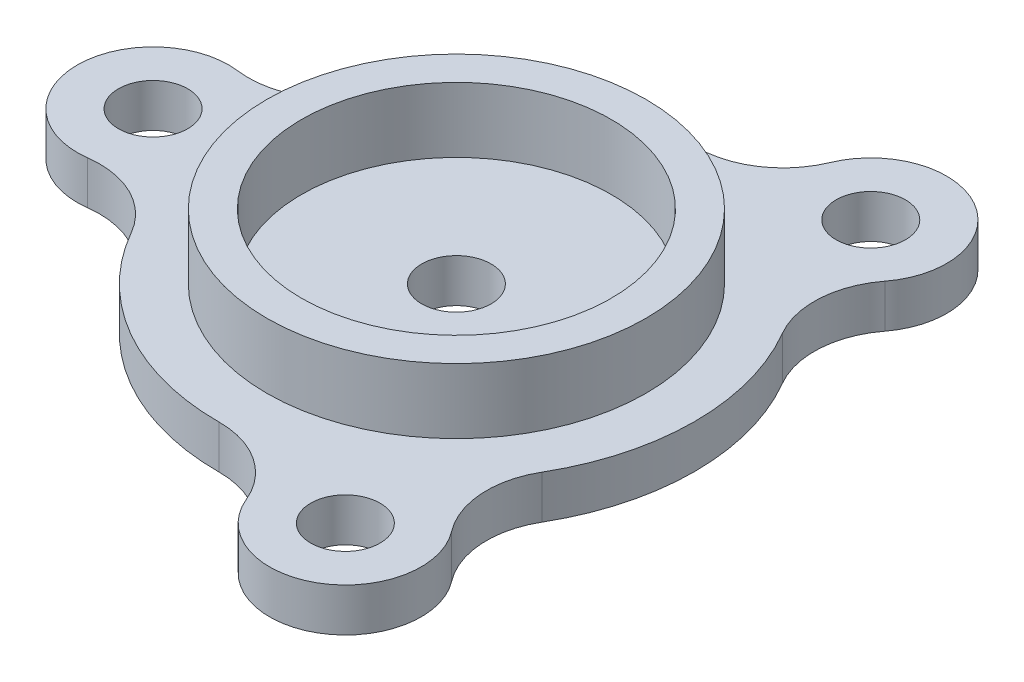
ISO-10303-21;
HEADER;
FILE_DESCRIPTION(('STEP AP214'),'2;1');
FILE_NAME('part.step','',(''),(''),'','','');
FILE_SCHEMA(('AUTOMOTIVE_DESIGN { 1 0 10303 214 1 1 1 1 }'));
ENDSEC;
DATA;
#1=APPLICATION_CONTEXT('core data for automotive mechanical design processes');
#2=APPLICATION_PROTOCOL_DEFINITION('international standard','automotive_design',2000,#1);
#3=PRODUCT_CONTEXT('',#1,'mechanical');
#4=PRODUCT('Part','Part','',(#3));
#5=PRODUCT_RELATED_PRODUCT_CATEGORY('part','',(#4));
#6=PRODUCT_DEFINITION_FORMATION('','',#4);
#7=PRODUCT_DEFINITION_CONTEXT('part definition',#1,'design');
#8=PRODUCT_DEFINITION('design','',#6,#7);
#9=PRODUCT_DEFINITION_SHAPE('','',#8);
#10=(LENGTH_UNIT() NAMED_UNIT(*) SI_UNIT(.MILLI.,.METRE.));
#11=(NAMED_UNIT(*) PLANE_ANGLE_UNIT() SI_UNIT($,.RADIAN.));
#12=(NAMED_UNIT(*) SI_UNIT($,.STERADIAN.) SOLID_ANGLE_UNIT());
#13=UNCERTAINTY_MEASURE_WITH_UNIT(LENGTH_MEASURE(1.E-05),#10,'distance_accuracy_value','');
#14=(GEOMETRIC_REPRESENTATION_CONTEXT(3) GLOBAL_UNCERTAINTY_ASSIGNED_CONTEXT((#13)) GLOBAL_UNIT_ASSIGNED_CONTEXT((#10,
#11,#12)) REPRESENTATION_CONTEXT('',''));
#15=CARTESIAN_POINT('',(0.,0.,0.));
#16=DIRECTION('',(0.,0.,1.));
#17=DIRECTION('',(1.,0.,0.));
#18=AXIS2_PLACEMENT_3D('',#15,#16,#17);
#19=CARTESIAN_POINT('',(0.,2.,0.));
#20=DIRECTION('',(0.,1.,0.));
#21=DIRECTION('',(0.,0.,1.));
#22=AXIS2_PLACEMENT_3D('',#19,#20,#21);
#23=PLANE('',#22);
#24=CARTESIAN_POINT('',(0.,2.,0.));
#25=DIRECTION('',(0.,1.,0.));
#26=DIRECTION('',(0.,0.,1.));
#27=AXIS2_PLACEMENT_3D('',#24,#25,#26);
#28=CIRCLE('',#27,1.6);
#29=CARTESIAN_POINT('',(0.,2.,1.6));
#30=VERTEX_POINT('',#29);
#31=EDGE_CURVE('E302',#30,#30,#28,.T.);
#32=ORIENTED_EDGE('',*,*,#31,.F.);
#33=EDGE_LOOP('',(#32));
#34=FACE_BOUND('',#33,.T.);
#35=CARTESIAN_POINT('',(0.,2.,0.));
#36=DIRECTION('',(0.,1.,0.));
#37=DIRECTION('',(0.,0.,1.));
#38=AXIS2_PLACEMENT_3D('',#35,#36,#37);
#39=CIRCLE('',#38,7.15);
#40=CARTESIAN_POINT('',(0.,2.,7.15));
#41=VERTEX_POINT('',#40);
#42=EDGE_CURVE('E11',#41,#41,#39,.F.);
#43=ORIENTED_EDGE('',*,*,#42,.F.);
#44=EDGE_LOOP('',(#43));
#45=FACE_BOUND('',#44,.T.);
#46=ADVANCED_FACE('F34',(#34,#45),#23,.T.);
#47=CARTESIAN_POINT('',(0.,2.,0.));
#48=DIRECTION('',(0.,-1.,0.));
#49=DIRECTION('',(0.,0.,-1.));
#50=AXIS2_PLACEMENT_3D('',#47,#48,#49);
#51=CYLINDRICAL_SURFACE('',#50,11.);
#52=DIRECTION('',(0.,1.,0.));
#53=VECTOR('',#52,1.);
#54=CARTESIAN_POINT('',(-9.55297619047619,-14.5152553066844,5.4534985013471));
#55=LINE('',#54,#53);
#56=CARTESIAN_POINT('',(-9.55297619047619,0.,5.4534985013471));
#57=VERTEX_POINT('',#56);
#58=CARTESIAN_POINT('',(-9.55297619047619,2.,5.45349850134709));
#59=VERTEX_POINT('',#58);
#60=EDGE_CURVE('E156',#57,#59,#55,.T.);
#61=ORIENTED_EDGE('',*,*,#60,.F.);
#62=CARTESIAN_POINT('',(0.,0.,0.));
#63=DIRECTION('',(0.,1.,0.));
#64=DIRECTION('',(0.,0.,1.));
#65=AXIS2_PLACEMENT_3D('',#62,#63,#64);
#66=CIRCLE('',#65,11.);
#67=CARTESIAN_POINT('',(0.0536198535711454,0.,10.9998693133738));
#68=VERTEX_POINT('',#67);
#69=EDGE_CURVE('E229',#57,#68,#66,.T.);
#70=ORIENTED_EDGE('',*,*,#69,.T.);
#71=DIRECTION('',(0.,1.,0.));
#72=VECTOR('',#71,1.);
#73=CARTESIAN_POINT('',(0.0536198535711407,-14.5152553066844,10.9998693133738));
#74=LINE('',#73,#72);
#75=CARTESIAN_POINT('',(0.0536198535711454,2.,10.9998693133738));
#76=VERTEX_POINT('',#75);
#77=EDGE_CURVE('E189',#68,#76,#74,.T.);
#78=ORIENTED_EDGE('',*,*,#77,.T.);
#79=CARTESIAN_POINT('',(0.,2.,0.));
#80=DIRECTION('',(0.,1.,0.));
#81=DIRECTION('',(0.,0.,1.));
#82=AXIS2_PLACEMENT_3D('',#79,#80,#81);
#83=CIRCLE('',#82,11.);
#84=EDGE_CURVE('E49',#59,#76,#83,.T.);
#85=ORIENTED_EDGE('',*,*,#84,.F.);
#86=EDGE_LOOP('',(#61,#70,#78,#85));
#87=FACE_BOUND('',#86,.T.);
#88=ADVANCED_FACE('F260',(#87),#51,.T.);
#89=DIRECTION('',(0.,1.,0.));
#90=VECTOR('',#89,1.);
#91=CARTESIAN_POINT('',(9.49935633690504,-14.5152553066844,5.54637081202673));
#92=LINE('',#91,#90);
#93=CARTESIAN_POINT('',(9.49935633690504,0.,5.54637081202673));
#94=VERTEX_POINT('',#93);
#95=CARTESIAN_POINT('',(9.49935633690504,2.,5.54637081202673));
#96=VERTEX_POINT('',#95);
#97=EDGE_CURVE('E185',#94,#96,#92,.T.);
#98=ORIENTED_EDGE('',*,*,#97,.F.);
#99=CARTESIAN_POINT('',(9.49935633690505,0.,-5.54637081202672));
#100=VERTEX_POINT('',#99);
#101=EDGE_CURVE('E226',#94,#100,#66,.T.);
#102=ORIENTED_EDGE('',*,*,#101,.T.);
#103=DIRECTION('',(0.,1.,0.));
#104=VECTOR('',#103,1.);
#105=CARTESIAN_POINT('',(9.49935633690505,-14.5152553066844,-5.54637081202672));
#106=LINE('',#105,#104);
#107=CARTESIAN_POINT('',(9.49935633690505,2.,-5.54637081202672));
#108=VERTEX_POINT('',#107);
#109=EDGE_CURVE('E202',#100,#108,#106,.T.);
#110=ORIENTED_EDGE('',*,*,#109,.T.);
#111=EDGE_CURVE('E227',#96,#108,#83,.T.);
#112=ORIENTED_EDGE('',*,*,#111,.F.);
#113=EDGE_LOOP('',(#98,#102,#110,#112));
#114=FACE_BOUND('',#113,.T.);
#115=ADVANCED_FACE('F233',(#114),#51,.T.);
#116=CARTESIAN_POINT('',(0.053619853571149,0.,-10.9998693133738));
#117=VERTEX_POINT('',#116);
#118=CARTESIAN_POINT('',(-9.55297619047619,0.,-5.45349850134709));
#119=VERTEX_POINT('',#118);
#120=EDGE_CURVE('E228',#117,#119,#66,.T.);
#121=ORIENTED_EDGE('',*,*,#120,.T.);
#122=DIRECTION('',(0.,1.,0.));
#123=VECTOR('',#122,1.);
#124=CARTESIAN_POINT('',(-9.55297619047619,-14.5152553066844,-5.45349850134709));
#125=LINE('',#124,#123);
#126=CARTESIAN_POINT('',(-9.55297619047619,2.,-5.45349850134709));
#127=VERTEX_POINT('',#126);
#128=EDGE_CURVE('E57',#119,#127,#125,.T.);
#129=ORIENTED_EDGE('',*,*,#128,.T.);
#130=CARTESIAN_POINT('',(0.053619853571149,2.,-10.9998693133738));
#131=VERTEX_POINT('',#130);
#132=EDGE_CURVE('E42',#131,#127,#83,.T.);
#133=ORIENTED_EDGE('',*,*,#132,.F.);
#134=DIRECTION('',(0.,1.,0.));
#135=VECTOR('',#134,1.);
#136=CARTESIAN_POINT('',(0.053619853571149,-14.5152553066844,-10.9998693133738));
#137=LINE('',#136,#135);
#138=EDGE_CURVE('E218',#117,#131,#137,.T.);
#139=ORIENTED_EDGE('',*,*,#138,.F.);
#140=EDGE_LOOP('',(#121,#129,#133,#139));
#141=FACE_BOUND('',#140,.T.);
#142=ADVANCED_FACE('F36',(#141),#51,.T.);
#143=CARTESIAN_POINT('',(0.,2.,0.));
#144=DIRECTION('',(0.,1.,0.));
#145=DIRECTION('',(0.,0.,1.));
#146=AXIS2_PLACEMENT_3D('',#143,#144,#145);
#147=CIRCLE('',#146,8.75);
#148=CARTESIAN_POINT('',(0.,2.,8.75));
#149=VERTEX_POINT('',#148);
#150=EDGE_CURVE('E296',#149,#149,#147,.T.);
#151=ORIENTED_EDGE('',*,*,#150,.F.);
#152=EDGE_LOOP('',(#151));
#153=FACE_BOUND('',#152,.T.);
#154=ORIENTED_EDGE('',*,*,#132,.T.);
#155=CARTESIAN_POINT('',(-13.0267857142857,2.,-7.43658886547331));
#156=DIRECTION('',(0.,-1.,0.));
#157=DIRECTION('',(0.,0.,1.));
#158=AXIS2_PLACEMENT_3D('',#155,#156,#157);
#159=CIRCLE('',#158,4.);
#160=CARTESIAN_POINT('',(-13.5458333333333,2.,-3.47040813722088));
#161=VERTEX_POINT('',#160);
#162=EDGE_CURVE('E129',#127,#161,#159,.T.);
#163=ORIENTED_EDGE('',*,*,#162,.T.);
#164=CARTESIAN_POINT('',(-14.,2.,0.));
#165=DIRECTION('',(0.,1.,0.));
#166=DIRECTION('',(0.,0.,1.));
#167=AXIS2_PLACEMENT_3D('',#164,#165,#166);
#168=CIRCLE('',#167,3.5);
#169=CARTESIAN_POINT('',(-13.5458333333333,2.,3.47040813722088));
#170=VERTEX_POINT('',#169);
#171=EDGE_CURVE('E137',#161,#170,#168,.T.);
#172=ORIENTED_EDGE('',*,*,#171,.T.);
#173=CARTESIAN_POINT('',(-13.0267857142857,2.,7.43658886547331));
#174=DIRECTION('',(0.,-1.,0.));
#175=DIRECTION('',(0.,0.,1.));
#176=AXIS2_PLACEMENT_3D('',#173,#174,#175);
#177=CIRCLE('',#176,4.);
#178=EDGE_CURVE('E143',#170,#59,#177,.T.);
#179=ORIENTED_EDGE('',*,*,#178,.T.);
#180=ORIENTED_EDGE('',*,*,#84,.T.);
#181=CARTESIAN_POINT('',(0.0731179821424711,2.,14.9998217909643));
#182=DIRECTION('',(0.,-1.,0.));
#183=DIRECTION('',(0.,0.,1.));
#184=AXIS2_PLACEMENT_3D('',#181,#182,#183);
#185=CIRCLE('',#184,4.);
#186=CARTESIAN_POINT('',(3.76745505833315,2.,13.4662398507072));
#187=VERTEX_POINT('',#186);
#188=EDGE_CURVE('E179',#76,#187,#185,.T.);
#189=ORIENTED_EDGE('',*,*,#188,.T.);
#190=CARTESIAN_POINT('',(7.,2.,12.1243556529821));
#191=DIRECTION('',(0.,1.,0.));
#192=DIRECTION('',(0.,0.,1.));
#193=AXIS2_PLACEMENT_3D('',#190,#191,#192);
#194=CIRCLE('',#193,3.5);
#195=CARTESIAN_POINT('',(9.77837827500018,2.,9.99583171348627));
#196=VERTEX_POINT('',#195);
#197=EDGE_CURVE('E182',#187,#196,#194,.T.);
#198=ORIENTED_EDGE('',*,*,#197,.T.);
#199=CARTESIAN_POINT('',(12.9536677321432,2.,7.56323292549099));
#200=DIRECTION('',(0.,-1.,0.));
#201=DIRECTION('',(0.,0.,1.));
#202=AXIS2_PLACEMENT_3D('',#199,#200,#201);
#203=CIRCLE('',#202,4.);
#204=EDGE_CURVE('E176',#196,#96,#203,.T.);
#205=ORIENTED_EDGE('',*,*,#204,.T.);
#206=ORIENTED_EDGE('',*,*,#111,.T.);
#207=CARTESIAN_POINT('',(12.9536677321432,2.,-7.56323292549098));
#208=DIRECTION('',(0.,-1.,0.));
#209=DIRECTION('',(0.,0.,1.));
#210=AXIS2_PLACEMENT_3D('',#207,#208,#209);
#211=CIRCLE('',#210,4.);
#212=CARTESIAN_POINT('',(9.77837827500019,2.,-9.99583171348627));
#213=VERTEX_POINT('',#212);
#214=EDGE_CURVE('E207',#108,#213,#211,.T.);
#215=ORIENTED_EDGE('',*,*,#214,.T.);
#216=CARTESIAN_POINT('',(7.00000000000001,2.,-12.1243556529821));
#217=DIRECTION('',(0.,1.,0.));
#218=DIRECTION('',(0.,0.,1.));
#219=AXIS2_PLACEMENT_3D('',#216,#217,#218);
#220=CIRCLE('',#219,3.5);
#221=CARTESIAN_POINT('',(3.76745505833316,2.,-13.4662398507071));
#222=VERTEX_POINT('',#221);
#223=EDGE_CURVE('E210',#213,#222,#220,.T.);
#224=ORIENTED_EDGE('',*,*,#223,.T.);
#225=CARTESIAN_POINT('',(0.0731179821424827,2.,-14.9998217909643));
#226=DIRECTION('',(0.,-1.,0.));
#227=DIRECTION('',(0.,0.,1.));
#228=AXIS2_PLACEMENT_3D('',#225,#226,#227);
#229=CIRCLE('',#228,3.99999999999999);
#230=EDGE_CURVE('E213',#222,#131,#229,.T.);
#231=ORIENTED_EDGE('',*,*,#230,.T.);
#232=EDGE_LOOP('',(#154,#163,#172,#179,#180,#189,#198,#205,#206,#215,#224,#231));
#233=FACE_BOUND('',#232,.T.);
#234=CARTESIAN_POINT('',(7.00000000000001,2.,-12.1243556529821));
#235=DIRECTION('',(0.,1.,0.));
#236=DIRECTION('',(0.,0.,1.));
#237=AXIS2_PLACEMENT_3D('',#234,#235,#236);
#238=CIRCLE('',#237,1.6);
#239=CARTESIAN_POINT('',(7.00000000000001,2.,-10.5243556529821));
#240=VERTEX_POINT('',#239);
#241=EDGE_CURVE('E195',#240,#240,#238,.T.);
#242=ORIENTED_EDGE('',*,*,#241,.F.);
#243=EDGE_LOOP('',(#242));
#244=FACE_BOUND('',#243,.T.);
#245=CARTESIAN_POINT('',(7.,2.,12.1243556529821));
#246=DIRECTION('',(0.,1.,0.));
#247=DIRECTION('',(0.,0.,1.));
#248=AXIS2_PLACEMENT_3D('',#245,#246,#247);
#249=CIRCLE('',#248,1.6);
#250=CARTESIAN_POINT('',(7.,2.,13.7243556529821));
#251=VERTEX_POINT('',#250);
#252=EDGE_CURVE('E164',#251,#251,#249,.T.);
#253=ORIENTED_EDGE('',*,*,#252,.F.);
#254=EDGE_LOOP('',(#253));
#255=FACE_BOUND('',#254,.T.);
#256=CARTESIAN_POINT('',(-14.,2.,0.));
#257=DIRECTION('',(0.,1.,0.));
#258=DIRECTION('',(0.,0.,1.));
#259=AXIS2_PLACEMENT_3D('',#256,#257,#258);
#260=CIRCLE('',#259,1.6);
#261=CARTESIAN_POINT('',(-14.,2.,1.6));
#262=VERTEX_POINT('',#261);
#263=EDGE_CURVE('E148',#262,#262,#260,.T.);
#264=ORIENTED_EDGE('',*,*,#263,.F.);
#265=EDGE_LOOP('',(#264));
#266=FACE_BOUND('',#265,.T.);
#267=ADVANCED_FACE('F145',(#153,#233,#244,#255,#266),#23,.T.);
#268=CARTESIAN_POINT('',(0.,0.,0.));
#269=DIRECTION('',(0.,1.,0.));
#270=DIRECTION('',(0.,0.,1.));
#271=AXIS2_PLACEMENT_3D('',#268,#269,#270);
#272=PLANE('',#271);
#273=CARTESIAN_POINT('',(0.,0.,0.));
#274=DIRECTION('',(0.,1.,0.));
#275=DIRECTION('',(0.,0.,1.));
#276=AXIS2_PLACEMENT_3D('',#273,#274,#275);
#277=CIRCLE('',#276,1.6);
#278=CARTESIAN_POINT('',(0.,0.,1.6));
#279=VERTEX_POINT('',#278);
#280=EDGE_CURVE('E151',#279,#279,#277,.F.);
#281=ORIENTED_EDGE('',*,*,#280,.F.);
#282=EDGE_LOOP('',(#281));
#283=FACE_BOUND('',#282,.T.);
#284=ORIENTED_EDGE('',*,*,#120,.F.);
#285=CARTESIAN_POINT('',(0.0731179821424827,0.,-14.9998217909643));
#286=DIRECTION('',(0.,1.,0.));
#287=DIRECTION('',(0.,0.,1.));
#288=AXIS2_PLACEMENT_3D('',#285,#286,#287);
#289=CIRCLE('',#288,3.99999999999999);
#290=CARTESIAN_POINT('',(3.76745505833316,0.,-13.4662398507071));
#291=VERTEX_POINT('',#290);
#292=EDGE_CURVE('E200',#117,#291,#289,.T.);
#293=ORIENTED_EDGE('',*,*,#292,.T.);
#294=CARTESIAN_POINT('',(7.00000000000001,0.,-12.1243556529821));
#295=DIRECTION('',(0.,1.,0.));
#296=DIRECTION('',(0.,0.,1.));
#297=AXIS2_PLACEMENT_3D('',#294,#295,#296);
#298=CIRCLE('',#297,3.5);
#299=CARTESIAN_POINT('',(9.77837827500019,0.,-9.99583171348627));
#300=VERTEX_POINT('',#299);
#301=EDGE_CURVE('E196',#291,#300,#298,.F.);
#302=ORIENTED_EDGE('',*,*,#301,.T.);
#303=CARTESIAN_POINT('',(12.9536677321432,0.,-7.56323292549098));
#304=DIRECTION('',(0.,1.,0.));
#305=DIRECTION('',(0.,0.,1.));
#306=AXIS2_PLACEMENT_3D('',#303,#304,#305);
#307=CIRCLE('',#306,4.);
#308=EDGE_CURVE('E199',#300,#100,#307,.T.);
#309=ORIENTED_EDGE('',*,*,#308,.T.);
#310=ORIENTED_EDGE('',*,*,#101,.F.);
#311=CARTESIAN_POINT('',(12.9536677321432,0.,7.56323292549099));
#312=DIRECTION('',(0.,1.,0.));
#313=DIRECTION('',(0.,0.,1.));
#314=AXIS2_PLACEMENT_3D('',#311,#312,#313);
#315=CIRCLE('',#314,4.);
#316=CARTESIAN_POINT('',(9.77837827500018,0.,9.99583171348627));
#317=VERTEX_POINT('',#316);
#318=EDGE_CURVE('E171',#94,#317,#315,.T.);
#319=ORIENTED_EDGE('',*,*,#318,.T.);
#320=CARTESIAN_POINT('',(7.,0.,12.1243556529821));
#321=DIRECTION('',(0.,1.,0.));
#322=DIRECTION('',(0.,0.,1.));
#323=AXIS2_PLACEMENT_3D('',#320,#321,#322);
#324=CIRCLE('',#323,3.5);
#325=CARTESIAN_POINT('',(3.76745505833315,0.,13.4662398507072));
#326=VERTEX_POINT('',#325);
#327=EDGE_CURVE('E168',#317,#326,#324,.F.);
#328=ORIENTED_EDGE('',*,*,#327,.T.);
#329=CARTESIAN_POINT('',(0.0731179821424711,0.,14.9998217909643));
#330=DIRECTION('',(0.,1.,0.));
#331=DIRECTION('',(0.,0.,1.));
#332=AXIS2_PLACEMENT_3D('',#329,#330,#331);
#333=CIRCLE('',#332,4.);
#334=EDGE_CURVE('E165',#326,#68,#333,.T.);
#335=ORIENTED_EDGE('',*,*,#334,.T.);
#336=ORIENTED_EDGE('',*,*,#69,.F.);
#337=CARTESIAN_POINT('',(-13.0267857142857,0.,7.43658886547331));
#338=DIRECTION('',(0.,1.,0.));
#339=DIRECTION('',(0.,0.,1.));
#340=AXIS2_PLACEMENT_3D('',#337,#338,#339);
#341=CIRCLE('',#340,4.);
#342=CARTESIAN_POINT('',(-13.5458333333333,0.,3.47040813722088));
#343=VERTEX_POINT('',#342);
#344=EDGE_CURVE('E262',#57,#343,#341,.T.);
#345=ORIENTED_EDGE('',*,*,#344,.T.);
#346=CARTESIAN_POINT('',(-14.,0.,0.));
#347=DIRECTION('',(0.,1.,0.));
#348=DIRECTION('',(0.,0.,1.));
#349=AXIS2_PLACEMENT_3D('',#346,#347,#348);
#350=CIRCLE('',#349,3.5);
#351=CARTESIAN_POINT('',(-13.5458333333333,0.,-3.47040813722088));
#352=VERTEX_POINT('',#351);
#353=EDGE_CURVE('E158',#343,#352,#350,.F.);
#354=ORIENTED_EDGE('',*,*,#353,.T.);
#355=CARTESIAN_POINT('',(-13.0267857142857,0.,-7.43658886547331));
#356=DIRECTION('',(0.,1.,0.));
#357=DIRECTION('',(0.,0.,1.));
#358=AXIS2_PLACEMENT_3D('',#355,#356,#357);
#359=CIRCLE('',#358,4.);
#360=EDGE_CURVE('E131',#352,#119,#359,.T.);
#361=ORIENTED_EDGE('',*,*,#360,.T.);
#362=EDGE_LOOP('',(#284,#293,#302,#309,#310,#319,#328,#335,#336,#345,#354,#361));
#363=FACE_BOUND('',#362,.T.);
#364=CARTESIAN_POINT('',(7.00000000000001,0.,-12.1243556529821));
#365=DIRECTION('',(0.,1.,0.));
#366=DIRECTION('',(0.,0.,1.));
#367=AXIS2_PLACEMENT_3D('',#364,#365,#366);
#368=CIRCLE('',#367,1.6);
#369=CARTESIAN_POINT('',(7.00000000000001,0.,-10.5243556529821));
#370=VERTEX_POINT('',#369);
#371=EDGE_CURVE('E198',#370,#370,#368,.F.);
#372=ORIENTED_EDGE('',*,*,#371,.F.);
#373=EDGE_LOOP('',(#372));
#374=FACE_BOUND('',#373,.T.);
#375=CARTESIAN_POINT('',(7.,0.,12.1243556529821));
#376=DIRECTION('',(0.,1.,0.));
#377=DIRECTION('',(0.,0.,1.));
#378=AXIS2_PLACEMENT_3D('',#375,#376,#377);
#379=CIRCLE('',#378,1.6);
#380=CARTESIAN_POINT('',(7.,0.,13.7243556529821));
#381=VERTEX_POINT('',#380);
#382=EDGE_CURVE('E173',#381,#381,#379,.F.);
#383=ORIENTED_EDGE('',*,*,#382,.F.);
#384=EDGE_LOOP('',(#383));
#385=FACE_BOUND('',#384,.T.);
#386=CARTESIAN_POINT('',(-14.,0.,0.));
#387=DIRECTION('',(0.,1.,0.));
#388=DIRECTION('',(0.,0.,1.));
#389=AXIS2_PLACEMENT_3D('',#386,#387,#388);
#390=CIRCLE('',#389,1.6);
#391=CARTESIAN_POINT('',(-14.,0.,1.6));
#392=VERTEX_POINT('',#391);
#393=EDGE_CURVE('E161',#392,#392,#390,.F.);
#394=ORIENTED_EDGE('',*,*,#393,.F.);
#395=EDGE_LOOP('',(#394));
#396=FACE_BOUND('',#395,.T.);
#397=ADVANCED_FACE('F239',(#283,#363,#374,#385,#396),#272,.F.);
#398=CARTESIAN_POINT('',(7.00000000000001,-14.5152553066844,-12.1243556529821));
#399=DIRECTION('',(0.,1.,0.));
#400=DIRECTION('',(0.,0.,1.));
#401=AXIS2_PLACEMENT_3D('',#398,#399,#400);
#402=CYLINDRICAL_SURFACE('',#401,3.5);
#403=ORIENTED_EDGE('',*,*,#301,.F.);
#404=DIRECTION('',(0.,1.,0.));
#405=VECTOR('',#404,1.);
#406=CARTESIAN_POINT('',(3.76745505833316,-14.5152553066844,-13.4662398507071));
#407=LINE('',#406,#405);
#408=EDGE_CURVE('E221',#291,#222,#407,.T.);
#409=ORIENTED_EDGE('',*,*,#408,.T.);
#410=ORIENTED_EDGE('',*,*,#223,.F.);
#411=DIRECTION('',(0.,1.,0.));
#412=VECTOR('',#411,1.);
#413=CARTESIAN_POINT('',(9.77837827500019,-14.5152553066844,-9.99583171348627));
#414=LINE('',#413,#412);
#415=EDGE_CURVE('E215',#300,#213,#414,.T.);
#416=ORIENTED_EDGE('',*,*,#415,.F.);
#417=EDGE_LOOP('',(#403,#409,#410,#416));
#418=FACE_BOUND('',#417,.T.);
#419=ADVANCED_FACE('F292',(#418),#402,.T.);
#420=CARTESIAN_POINT('',(0.0731179821424827,-14.5152553066844,-14.9998217909643));
#421=DIRECTION('',(0.,1.,0.));
#422=DIRECTION('',(0.,0.,1.));
#423=AXIS2_PLACEMENT_3D('',#420,#421,#422);
#424=CYLINDRICAL_SURFACE('',#423,3.99999999999999);
#425=ORIENTED_EDGE('',*,*,#292,.F.);
#426=ORIENTED_EDGE('',*,*,#138,.T.);
#427=ORIENTED_EDGE('',*,*,#230,.F.);
#428=ORIENTED_EDGE('',*,*,#408,.F.);
#429=EDGE_LOOP('',(#425,#426,#427,#428));
#430=FACE_BOUND('',#429,.T.);
#431=ADVANCED_FACE('F315',(#430),#424,.F.);
#432=CARTESIAN_POINT('',(12.9536677321432,-14.5152553066844,-7.56323292549098));
#433=DIRECTION('',(0.,1.,0.));
#434=DIRECTION('',(0.,0.,1.));
#435=AXIS2_PLACEMENT_3D('',#432,#433,#434);
#436=CYLINDRICAL_SURFACE('',#435,4.);
#437=ORIENTED_EDGE('',*,*,#308,.F.);
#438=ORIENTED_EDGE('',*,*,#415,.T.);
#439=ORIENTED_EDGE('',*,*,#214,.F.);
#440=ORIENTED_EDGE('',*,*,#109,.F.);
#441=EDGE_LOOP('',(#437,#438,#439,#440));
#442=FACE_BOUND('',#441,.T.);
#443=ADVANCED_FACE('F244',(#442),#436,.F.);
#444=CARTESIAN_POINT('',(7.00000000000001,-14.5152553066844,-12.1243556529821));
#445=DIRECTION('',(0.,1.,0.));
#446=DIRECTION('',(0.,0.,1.));
#447=AXIS2_PLACEMENT_3D('',#444,#445,#446);
#448=CYLINDRICAL_SURFACE('',#447,1.6);
#449=CARTESIAN_POINT('',(7.00000000000001,0.,-10.5243556529821));
#450=CARTESIAN_POINT('',(7.00000000000001,0.0208333333333333,-10.5243556529821));
#451=CARTESIAN_POINT('',(7.00000000000001,0.0416666666666667,-10.5243556529821));
#452=CARTESIAN_POINT('',(7.00000000000001,0.0833333333333334,-10.5243556529821));
#453=CARTESIAN_POINT('',(7.00000000000001,0.104166666666667,-10.5243556529821));
#454=CARTESIAN_POINT('',(7.00000000000001,0.145833333333333,-10.5243556529821));
#455=CARTESIAN_POINT('',(7.00000000000001,0.166666666666667,-10.5243556529821));
#456=CARTESIAN_POINT('',(7.00000000000001,0.208333333333334,-10.5243556529821));
#457=CARTESIAN_POINT('',(7.00000000000001,0.229166666666667,-10.5243556529821));
#458=CARTESIAN_POINT('',(7.00000000000001,0.270833333333334,-10.5243556529821));
#459=CARTESIAN_POINT('',(7.00000000000001,0.291666666666667,-10.5243556529821));
#460=CARTESIAN_POINT('',(7.00000000000001,0.333333333333334,-10.5243556529821));
#461=CARTESIAN_POINT('',(7.00000000000001,0.354166666666667,-10.5243556529821));
#462=CARTESIAN_POINT('',(7.00000000000001,0.395833333333334,-10.5243556529821));
#463=CARTESIAN_POINT('',(7.00000000000001,0.416666666666667,-10.5243556529821));
#464=CARTESIAN_POINT('',(7.00000000000001,0.458333333333334,-10.5243556529821));
#465=CARTESIAN_POINT('',(7.00000000000001,0.479166666666667,-10.5243556529821));
#466=CARTESIAN_POINT('',(7.00000000000001,0.520833333333334,-10.5243556529821));
#467=CARTESIAN_POINT('',(7.00000000000001,0.541666666666667,-10.5243556529821));
#468=CARTESIAN_POINT('',(7.00000000000001,0.583333333333334,-10.5243556529821));
#469=CARTESIAN_POINT('',(7.00000000000001,0.604166666666667,-10.5243556529821));
#470=CARTESIAN_POINT('',(7.00000000000001,0.645833333333334,-10.5243556529821));
#471=CARTESIAN_POINT('',(7.00000000000001,0.666666666666667,-10.5243556529821));
#472=CARTESIAN_POINT('',(7.00000000000001,0.708333333333334,-10.5243556529821));
#473=CARTESIAN_POINT('',(7.00000000000001,0.729166666666667,-10.5243556529821));
#474=CARTESIAN_POINT('',(7.00000000000001,0.770833333333334,-10.5243556529821));
#475=CARTESIAN_POINT('',(7.00000000000001,0.791666666666667,-10.5243556529821));
#476=CARTESIAN_POINT('',(7.00000000000001,0.833333333333334,-10.5243556529821));
#477=CARTESIAN_POINT('',(7.00000000000001,0.854166666666667,-10.5243556529821));
#478=CARTESIAN_POINT('',(7.00000000000001,0.895833333333334,-10.5243556529821));
#479=CARTESIAN_POINT('',(7.00000000000001,0.916666666666668,-10.5243556529821));
#480=CARTESIAN_POINT('',(7.00000000000001,0.958333333333334,-10.5243556529821));
#481=CARTESIAN_POINT('',(7.00000000000001,0.979166666666668,-10.5243556529821));
#482=CARTESIAN_POINT('',(7.00000000000001,1.02083333333333,-10.5243556529821));
#483=CARTESIAN_POINT('',(7.00000000000001,1.04166666666667,-10.5243556529821));
#484=CARTESIAN_POINT('',(7.00000000000001,1.08333333333333,-10.5243556529821));
#485=CARTESIAN_POINT('',(7.00000000000001,1.10416666666667,-10.5243556529821));
#486=CARTESIAN_POINT('',(7.00000000000001,1.14583333333333,-10.5243556529821));
#487=CARTESIAN_POINT('',(7.00000000000001,1.16666666666667,-10.5243556529821));
#488=CARTESIAN_POINT('',(7.00000000000001,1.20833333333333,-10.5243556529821));
#489=CARTESIAN_POINT('',(7.00000000000001,1.22916666666667,-10.5243556529821));
#490=CARTESIAN_POINT('',(7.00000000000001,1.27083333333333,-10.5243556529821));
#491=CARTESIAN_POINT('',(7.00000000000001,1.29166666666667,-10.5243556529821));
#492=CARTESIAN_POINT('',(7.00000000000001,1.33333333333333,-10.5243556529821));
#493=CARTESIAN_POINT('',(7.00000000000001,1.35416666666667,-10.5243556529821));
#494=CARTESIAN_POINT('',(7.00000000000001,1.39583333333333,-10.5243556529821));
#495=CARTESIAN_POINT('',(7.00000000000001,1.41666666666667,-10.5243556529821));
#496=CARTESIAN_POINT('',(7.00000000000001,1.45833333333333,-10.5243556529821));
#497=CARTESIAN_POINT('',(7.00000000000001,1.47916666666667,-10.5243556529821));
#498=CARTESIAN_POINT('',(7.00000000000001,1.52083333333333,-10.5243556529821));
#499=CARTESIAN_POINT('',(7.00000000000001,1.54166666666667,-10.5243556529821));
#500=CARTESIAN_POINT('',(7.00000000000001,1.58333333333333,-10.5243556529821));
#501=CARTESIAN_POINT('',(7.00000000000001,1.60416666666667,-10.5243556529821));
#502=CARTESIAN_POINT('',(7.00000000000001,1.64583333333333,-10.5243556529821));
#503=CARTESIAN_POINT('',(7.00000000000001,1.66666666666667,-10.5243556529821));
#504=CARTESIAN_POINT('',(7.00000000000001,1.70833333333333,-10.5243556529821));
#505=CARTESIAN_POINT('',(7.00000000000001,1.72916666666667,-10.5243556529821));
#506=CARTESIAN_POINT('',(7.00000000000001,1.77083333333333,-10.5243556529821));
#507=CARTESIAN_POINT('',(7.00000000000001,1.79166666666667,-10.5243556529821));
#508=CARTESIAN_POINT('',(7.00000000000001,1.83333333333333,-10.5243556529821));
#509=CARTESIAN_POINT('',(7.00000000000001,1.85416666666667,-10.5243556529821));
#510=CARTESIAN_POINT('',(7.00000000000001,1.89583333333333,-10.5243556529821));
#511=CARTESIAN_POINT('',(7.00000000000001,1.91666666666667,-10.5243556529821));
#512=CARTESIAN_POINT('',(7.00000000000001,1.95833333333333,-10.5243556529821));
#513=CARTESIAN_POINT('',(7.00000000000001,1.97916666666667,-10.5243556529821));
#514=CARTESIAN_POINT('',(7.00000000000001,2.,-10.5243556529821));
#515=B_SPLINE_CURVE_WITH_KNOTS('',3,(#449,#450,#451,#452,#453,#454,#455,#456,#457,#458,#459,
#460,#461,#462,#463,#464,#465,#466,#467,#468,#469,#470,#471,#472,#473,#474,#475,#476,#477,#478,
#479,#480,#481,#482,#483,#484,#485,#486,#487,#488,#489,#490,#491,#492,#493,#494,#495,#496,#497,
#498,#499,#500,#501,#502,#503,#504,#505,#506,#507,#508,#509,#510,#511,#512,#513,#514),
.UNSPECIFIED.,.F.,.F.,(4,2,2,2,2,2,2,2,2,2,2,2,2,2,2,2,2,2,2,2,2,2,2,2,2,2,2,2,2,2,2,2,4),(0.,
0.0625000000000001,0.125,0.1875,0.25,0.3125,0.375,0.4375,0.5,0.5625,0.625000000000001,
0.687500000000001,0.750000000000001,0.812500000000001,0.875000000000001,0.937500000000001,1.,
1.0625,1.125,1.1875,1.25,1.3125,1.375,1.4375,1.5,1.5625,1.625,1.6875,1.75,1.8125,1.875,1.9375,
2.),.UNSPECIFIED.);
#516=EDGE_CURVE('BSEAM325',#370,#240,#515,.T.);
#517=ORIENTED_EDGE('',*,*,#371,.T.);
#518=ORIENTED_EDGE('',*,*,#241,.T.);
#519=ORIENTED_EDGE('',*,*,#516,.T.);
#520=ORIENTED_EDGE('',*,*,#516,.F.);
#521=EDGE_LOOP('',(#517,#519,#518,#520));
#522=FACE_BOUND('',#521,.T.);
#523=ADVANCED_FACE('F325',(#522),#448,.F.);
#524=CARTESIAN_POINT('',(0.0731179821424711,-14.5152553066844,14.9998217909643));
#525=DIRECTION('',(0.,1.,0.));
#526=DIRECTION('',(0.,0.,1.));
#527=AXIS2_PLACEMENT_3D('',#524,#525,#526);
#528=CYLINDRICAL_SURFACE('',#527,4.);
#529=ORIENTED_EDGE('',*,*,#334,.F.);
#530=DIRECTION('',(0.,1.,0.));
#531=VECTOR('',#530,1.);
#532=CARTESIAN_POINT('',(3.76745505833315,-14.5152553066844,13.4662398507072));
#533=LINE('',#532,#531);
#534=EDGE_CURVE('E187',#326,#187,#533,.T.);
#535=ORIENTED_EDGE('',*,*,#534,.T.);
#536=ORIENTED_EDGE('',*,*,#188,.F.);
#537=ORIENTED_EDGE('',*,*,#77,.F.);
#538=EDGE_LOOP('',(#529,#535,#536,#537));
#539=FACE_BOUND('',#538,.T.);
#540=ADVANCED_FACE('F258',(#539),#528,.F.);
#541=CARTESIAN_POINT('',(7.,-14.5152553066844,12.1243556529821));
#542=DIRECTION('',(0.,1.,0.));
#543=DIRECTION('',(0.,0.,1.));
#544=AXIS2_PLACEMENT_3D('',#541,#542,#543);
#545=CYLINDRICAL_SURFACE('',#544,3.5);
#546=ORIENTED_EDGE('',*,*,#327,.F.);
#547=DIRECTION('',(0.,1.,0.));
#548=VECTOR('',#547,1.);
#549=CARTESIAN_POINT('',(9.77837827500018,-14.5152553066844,9.99583171348627));
#550=LINE('',#549,#548);
#551=EDGE_CURVE('E169',#317,#196,#550,.T.);
#552=ORIENTED_EDGE('',*,*,#551,.T.);
#553=ORIENTED_EDGE('',*,*,#197,.F.);
#554=ORIENTED_EDGE('',*,*,#534,.F.);
#555=EDGE_LOOP('',(#546,#552,#553,#554));
#556=FACE_BOUND('',#555,.T.);
#557=ADVANCED_FACE('F254',(#556),#545,.T.);
#558=CARTESIAN_POINT('',(12.9536677321432,-14.5152553066844,7.56323292549099));
#559=DIRECTION('',(0.,1.,0.));
#560=DIRECTION('',(0.,0.,1.));
#561=AXIS2_PLACEMENT_3D('',#558,#559,#560);
#562=CYLINDRICAL_SURFACE('',#561,4.);
#563=ORIENTED_EDGE('',*,*,#318,.F.);
#564=ORIENTED_EDGE('',*,*,#97,.T.);
#565=ORIENTED_EDGE('',*,*,#204,.F.);
#566=ORIENTED_EDGE('',*,*,#551,.F.);
#567=EDGE_LOOP('',(#563,#564,#565,#566));
#568=FACE_BOUND('',#567,.T.);
#569=ADVANCED_FACE('F248',(#568),#562,.F.);
#570=CARTESIAN_POINT('',(7.,-14.5152553066844,12.1243556529821));
#571=DIRECTION('',(0.,1.,0.));
#572=DIRECTION('',(0.,0.,1.));
#573=AXIS2_PLACEMENT_3D('',#570,#571,#572);
#574=CYLINDRICAL_SURFACE('',#573,1.6);
#575=CARTESIAN_POINT('',(7.,0.,13.7243556529821));
#576=CARTESIAN_POINT('',(7.,0.0208333333333333,13.7243556529821));
#577=CARTESIAN_POINT('',(7.,0.0416666666666667,13.7243556529821));
#578=CARTESIAN_POINT('',(7.,0.0833333333333334,13.7243556529821));
#579=CARTESIAN_POINT('',(7.,0.104166666666667,13.7243556529821));
#580=CARTESIAN_POINT('',(7.,0.145833333333333,13.7243556529821));
#581=CARTESIAN_POINT('',(7.,0.166666666666667,13.7243556529821));
#582=CARTESIAN_POINT('',(7.,0.208333333333334,13.7243556529821));
#583=CARTESIAN_POINT('',(7.,0.229166666666667,13.7243556529821));
#584=CARTESIAN_POINT('',(7.,0.270833333333334,13.7243556529821));
#585=CARTESIAN_POINT('',(7.,0.291666666666667,13.7243556529821));
#586=CARTESIAN_POINT('',(7.,0.333333333333334,13.7243556529821));
#587=CARTESIAN_POINT('',(7.,0.354166666666667,13.7243556529821));
#588=CARTESIAN_POINT('',(7.,0.395833333333334,13.7243556529821));
#589=CARTESIAN_POINT('',(7.,0.416666666666667,13.7243556529821));
#590=CARTESIAN_POINT('',(7.,0.458333333333334,13.7243556529821));
#591=CARTESIAN_POINT('',(7.,0.479166666666667,13.7243556529821));
#592=CARTESIAN_POINT('',(7.,0.520833333333334,13.7243556529821));
#593=CARTESIAN_POINT('',(7.,0.541666666666667,13.7243556529821));
#594=CARTESIAN_POINT('',(7.,0.583333333333334,13.7243556529821));
#595=CARTESIAN_POINT('',(7.,0.604166666666667,13.7243556529821));
#596=CARTESIAN_POINT('',(7.,0.645833333333334,13.7243556529821));
#597=CARTESIAN_POINT('',(7.,0.666666666666667,13.7243556529821));
#598=CARTESIAN_POINT('',(7.,0.708333333333334,13.7243556529821));
#599=CARTESIAN_POINT('',(7.,0.729166666666667,13.7243556529821));
#600=CARTESIAN_POINT('',(7.,0.770833333333334,13.7243556529821));
#601=CARTESIAN_POINT('',(7.,0.791666666666667,13.7243556529821));
#602=CARTESIAN_POINT('',(7.,0.833333333333334,13.7243556529821));
#603=CARTESIAN_POINT('',(7.,0.854166666666667,13.7243556529821));
#604=CARTESIAN_POINT('',(7.,0.895833333333334,13.7243556529821));
#605=CARTESIAN_POINT('',(7.,0.916666666666668,13.7243556529821));
#606=CARTESIAN_POINT('',(7.,0.958333333333334,13.7243556529821));
#607=CARTESIAN_POINT('',(7.,0.979166666666668,13.7243556529821));
#608=CARTESIAN_POINT('',(7.,1.02083333333333,13.7243556529821));
#609=CARTESIAN_POINT('',(7.,1.04166666666667,13.7243556529821));
#610=CARTESIAN_POINT('',(7.,1.08333333333333,13.7243556529821));
#611=CARTESIAN_POINT('',(7.,1.10416666666667,13.7243556529821));
#612=CARTESIAN_POINT('',(7.,1.14583333333333,13.7243556529821));
#613=CARTESIAN_POINT('',(7.,1.16666666666667,13.7243556529821));
#614=CARTESIAN_POINT('',(7.,1.20833333333333,13.7243556529821));
#615=CARTESIAN_POINT('',(7.,1.22916666666667,13.7243556529821));
#616=CARTESIAN_POINT('',(7.,1.27083333333333,13.7243556529821));
#617=CARTESIAN_POINT('',(7.,1.29166666666667,13.7243556529821));
#618=CARTESIAN_POINT('',(7.,1.33333333333333,13.7243556529821));
#619=CARTESIAN_POINT('',(7.,1.35416666666667,13.7243556529821));
#620=CARTESIAN_POINT('',(7.,1.39583333333333,13.7243556529821));
#621=CARTESIAN_POINT('',(7.,1.41666666666667,13.7243556529821));
#622=CARTESIAN_POINT('',(7.,1.45833333333333,13.7243556529821));
#623=CARTESIAN_POINT('',(7.,1.47916666666667,13.7243556529821));
#624=CARTESIAN_POINT('',(7.,1.52083333333333,13.7243556529821));
#625=CARTESIAN_POINT('',(7.,1.54166666666667,13.7243556529821));
#626=CARTESIAN_POINT('',(7.,1.58333333333333,13.7243556529821));
#627=CARTESIAN_POINT('',(7.,1.60416666666667,13.7243556529821));
#628=CARTESIAN_POINT('',(7.,1.64583333333333,13.7243556529821));
#629=CARTESIAN_POINT('',(7.,1.66666666666667,13.7243556529821));
#630=CARTESIAN_POINT('',(7.,1.70833333333333,13.7243556529821));
#631=CARTESIAN_POINT('',(7.,1.72916666666667,13.7243556529821));
#632=CARTESIAN_POINT('',(7.,1.77083333333333,13.7243556529821));
#633=CARTESIAN_POINT('',(7.,1.79166666666667,13.7243556529821));
#634=CARTESIAN_POINT('',(7.,1.83333333333333,13.7243556529821));
#635=CARTESIAN_POINT('',(7.,1.85416666666667,13.7243556529821));
#636=CARTESIAN_POINT('',(7.,1.89583333333333,13.7243556529821));
#637=CARTESIAN_POINT('',(7.,1.91666666666667,13.7243556529821));
#638=CARTESIAN_POINT('',(7.,1.95833333333333,13.7243556529821));
#639=CARTESIAN_POINT('',(7.,1.97916666666667,13.7243556529821));
#640=CARTESIAN_POINT('',(7.,2.,13.7243556529821));
#641=B_SPLINE_CURVE_WITH_KNOTS('',3,(#575,#576,#577,#578,#579,#580,#581,#582,#583,#584,#585,
#586,#587,#588,#589,#590,#591,#592,#593,#594,#595,#596,#597,#598,#599,#600,#601,#602,#603,#604,
#605,#606,#607,#608,#609,#610,#611,#612,#613,#614,#615,#616,#617,#618,#619,#620,#621,#622,#623,
#624,#625,#626,#627,#628,#629,#630,#631,#632,#633,#634,#635,#636,#637,#638,#639,#640),
.UNSPECIFIED.,.F.,.F.,(4,2,2,2,2,2,2,2,2,2,2,2,2,2,2,2,2,2,2,2,2,2,2,2,2,2,2,2,2,2,2,2,4),(0.,
0.0625000000000001,0.125,0.1875,0.25,0.3125,0.375,0.4375,0.5,0.5625,0.625000000000001,
0.687500000000001,0.750000000000001,0.812500000000001,0.875000000000001,0.937500000000001,1.,
1.0625,1.125,1.1875,1.25,1.3125,1.375,1.4375,1.5,1.5625,1.625,1.6875,1.75,1.8125,1.875,1.9375,
2.),.UNSPECIFIED.);
#642=EDGE_CURVE('BSEAM337',#381,#251,#641,.T.);
#643=ORIENTED_EDGE('',*,*,#382,.T.);
#644=ORIENTED_EDGE('',*,*,#252,.T.);
#645=ORIENTED_EDGE('',*,*,#642,.T.);
#646=ORIENTED_EDGE('',*,*,#642,.F.);
#647=EDGE_LOOP('',(#643,#645,#644,#646));
#648=FACE_BOUND('',#647,.T.);
#649=ADVANCED_FACE('F337',(#648),#574,.F.);
#650=CARTESIAN_POINT('',(-13.0267857142857,-14.5152553066844,-7.43658886547331));
#651=DIRECTION('',(0.,1.,0.));
#652=DIRECTION('',(0.,0.,1.));
#653=AXIS2_PLACEMENT_3D('',#650,#651,#652);
#654=CYLINDRICAL_SURFACE('',#653,4.);
#655=ORIENTED_EDGE('',*,*,#360,.F.);
#656=DIRECTION('',(0.,1.,0.));
#657=VECTOR('',#656,1.);
#658=CARTESIAN_POINT('',(-13.5458333333333,-14.5152553066844,-3.47040813722088));
#659=LINE('',#658,#657);
#660=EDGE_CURVE('E125',#352,#161,#659,.T.);
#661=ORIENTED_EDGE('',*,*,#660,.T.);
#662=ORIENTED_EDGE('',*,*,#162,.F.);
#663=ORIENTED_EDGE('',*,*,#128,.F.);
#664=EDGE_LOOP('',(#655,#661,#662,#663));
#665=FACE_BOUND('',#664,.T.);
#666=ADVANCED_FACE('F127',(#665),#654,.F.);
#667=CARTESIAN_POINT('',(-14.,-14.5152553066844,0.));
#668=DIRECTION('',(0.,1.,0.));
#669=DIRECTION('',(0.,0.,1.));
#670=AXIS2_PLACEMENT_3D('',#667,#668,#669);
#671=CYLINDRICAL_SURFACE('',#670,3.5);
#672=ORIENTED_EDGE('',*,*,#353,.F.);
#673=DIRECTION('',(0.,1.,0.));
#674=VECTOR('',#673,1.);
#675=CARTESIAN_POINT('',(-13.5458333333333,-14.5152553066844,3.47040813722088));
#676=LINE('',#675,#674);
#677=EDGE_CURVE('E134',#343,#170,#676,.T.);
#678=ORIENTED_EDGE('',*,*,#677,.T.);
#679=ORIENTED_EDGE('',*,*,#171,.F.);
#680=ORIENTED_EDGE('',*,*,#660,.F.);
#681=EDGE_LOOP('',(#672,#678,#679,#680));
#682=FACE_BOUND('',#681,.T.);
#683=ADVANCED_FACE('F138',(#682),#671,.T.);
#684=CARTESIAN_POINT('',(-13.0267857142857,-14.5152553066844,7.43658886547331));
#685=DIRECTION('',(0.,1.,0.));
#686=DIRECTION('',(0.,0.,1.));
#687=AXIS2_PLACEMENT_3D('',#684,#685,#686);
#688=CYLINDRICAL_SURFACE('',#687,4.);
#689=ORIENTED_EDGE('',*,*,#344,.F.);
#690=ORIENTED_EDGE('',*,*,#60,.T.);
#691=ORIENTED_EDGE('',*,*,#178,.F.);
#692=ORIENTED_EDGE('',*,*,#677,.F.);
#693=EDGE_LOOP('',(#689,#690,#691,#692));
#694=FACE_BOUND('',#693,.T.);
#695=ADVANCED_FACE('F265',(#694),#688,.F.);
#696=CARTESIAN_POINT('',(-14.,-14.5152553066844,0.));
#697=DIRECTION('',(0.,1.,0.));
#698=DIRECTION('',(0.,0.,1.));
#699=AXIS2_PLACEMENT_3D('',#696,#697,#698);
#700=CYLINDRICAL_SURFACE('',#699,1.6);
#701=CARTESIAN_POINT('',(-14.,0.,1.6));
#702=CARTESIAN_POINT('',(-14.,0.0208333333333333,1.6));
#703=CARTESIAN_POINT('',(-14.,0.0416666666666667,1.6));
#704=CARTESIAN_POINT('',(-14.,0.0833333333333334,1.6));
#705=CARTESIAN_POINT('',(-14.,0.104166666666667,1.6));
#706=CARTESIAN_POINT('',(-14.,0.145833333333333,1.6));
#707=CARTESIAN_POINT('',(-14.,0.166666666666667,1.6));
#708=CARTESIAN_POINT('',(-14.,0.208333333333334,1.6));
#709=CARTESIAN_POINT('',(-14.,0.229166666666667,1.6));
#710=CARTESIAN_POINT('',(-14.,0.270833333333334,1.6));
#711=CARTESIAN_POINT('',(-14.,0.291666666666667,1.6));
#712=CARTESIAN_POINT('',(-14.,0.333333333333334,1.6));
#713=CARTESIAN_POINT('',(-14.,0.354166666666667,1.6));
#714=CARTESIAN_POINT('',(-14.,0.395833333333334,1.6));
#715=CARTESIAN_POINT('',(-14.,0.416666666666667,1.6));
#716=CARTESIAN_POINT('',(-14.,0.458333333333334,1.6));
#717=CARTESIAN_POINT('',(-14.,0.479166666666667,1.6));
#718=CARTESIAN_POINT('',(-14.,0.520833333333334,1.6));
#719=CARTESIAN_POINT('',(-14.,0.541666666666667,1.6));
#720=CARTESIAN_POINT('',(-14.,0.583333333333334,1.6));
#721=CARTESIAN_POINT('',(-14.,0.604166666666667,1.6));
#722=CARTESIAN_POINT('',(-14.,0.645833333333334,1.6));
#723=CARTESIAN_POINT('',(-14.,0.666666666666667,1.6));
#724=CARTESIAN_POINT('',(-14.,0.708333333333334,1.6));
#725=CARTESIAN_POINT('',(-14.,0.729166666666667,1.6));
#726=CARTESIAN_POINT('',(-14.,0.770833333333334,1.6));
#727=CARTESIAN_POINT('',(-14.,0.791666666666667,1.6));
#728=CARTESIAN_POINT('',(-14.,0.833333333333334,1.6));
#729=CARTESIAN_POINT('',(-14.,0.854166666666667,1.6));
#730=CARTESIAN_POINT('',(-14.,0.895833333333334,1.6));
#731=CARTESIAN_POINT('',(-14.,0.916666666666668,1.6));
#732=CARTESIAN_POINT('',(-14.,0.958333333333334,1.6));
#733=CARTESIAN_POINT('',(-14.,0.979166666666668,1.6));
#734=CARTESIAN_POINT('',(-14.,1.02083333333333,1.6));
#735=CARTESIAN_POINT('',(-14.,1.04166666666667,1.6));
#736=CARTESIAN_POINT('',(-14.,1.08333333333333,1.6));
#737=CARTESIAN_POINT('',(-14.,1.10416666666667,1.6));
#738=CARTESIAN_POINT('',(-14.,1.14583333333333,1.6));
#739=CARTESIAN_POINT('',(-14.,1.16666666666667,1.6));
#740=CARTESIAN_POINT('',(-14.,1.20833333333333,1.6));
#741=CARTESIAN_POINT('',(-14.,1.22916666666667,1.6));
#742=CARTESIAN_POINT('',(-14.,1.27083333333333,1.6));
#743=CARTESIAN_POINT('',(-14.,1.29166666666667,1.6));
#744=CARTESIAN_POINT('',(-14.,1.33333333333333,1.6));
#745=CARTESIAN_POINT('',(-14.,1.35416666666667,1.6));
#746=CARTESIAN_POINT('',(-14.,1.39583333333333,1.6));
#747=CARTESIAN_POINT('',(-14.,1.41666666666667,1.6));
#748=CARTESIAN_POINT('',(-14.,1.45833333333333,1.6));
#749=CARTESIAN_POINT('',(-14.,1.47916666666667,1.6));
#750=CARTESIAN_POINT('',(-14.,1.52083333333333,1.6));
#751=CARTESIAN_POINT('',(-14.,1.54166666666667,1.6));
#752=CARTESIAN_POINT('',(-14.,1.58333333333333,1.6));
#753=CARTESIAN_POINT('',(-14.,1.60416666666667,1.6));
#754=CARTESIAN_POINT('',(-14.,1.64583333333333,1.6));
#755=CARTESIAN_POINT('',(-14.,1.66666666666667,1.6));
#756=CARTESIAN_POINT('',(-14.,1.70833333333333,1.6));
#757=CARTESIAN_POINT('',(-14.,1.72916666666667,1.6));
#758=CARTESIAN_POINT('',(-14.,1.77083333333333,1.6));
#759=CARTESIAN_POINT('',(-14.,1.79166666666667,1.6));
#760=CARTESIAN_POINT('',(-14.,1.83333333333333,1.6));
#761=CARTESIAN_POINT('',(-14.,1.85416666666667,1.6));
#762=CARTESIAN_POINT('',(-14.,1.89583333333333,1.6));
#763=CARTESIAN_POINT('',(-14.,1.91666666666667,1.6));
#764=CARTESIAN_POINT('',(-14.,1.95833333333333,1.6));
#765=CARTESIAN_POINT('',(-14.,1.97916666666667,1.6));
#766=CARTESIAN_POINT('',(-14.,2.,1.6));
#767=B_SPLINE_CURVE_WITH_KNOTS('',3,(#701,#702,#703,#704,#705,#706,#707,#708,#709,#710,#711,
#712,#713,#714,#715,#716,#717,#718,#719,#720,#721,#722,#723,#724,#725,#726,#727,#728,#729,#730,
#731,#732,#733,#734,#735,#736,#737,#738,#739,#740,#741,#742,#743,#744,#745,#746,#747,#748,#749,
#750,#751,#752,#753,#754,#755,#756,#757,#758,#759,#760,#761,#762,#763,#764,#765,#766),
.UNSPECIFIED.,.F.,.F.,(4,2,2,2,2,2,2,2,2,2,2,2,2,2,2,2,2,2,2,2,2,2,2,2,2,2,2,2,2,2,2,2,4),(0.,
0.0625000000000001,0.125,0.1875,0.25,0.3125,0.375,0.4375,0.5,0.5625,0.625000000000001,
0.687500000000001,0.750000000000001,0.812500000000001,0.875000000000001,0.937500000000001,1.,
1.0625,1.125,1.1875,1.25,1.3125,1.375,1.4375,1.5,1.5625,1.625,1.6875,1.75,1.8125,1.875,1.9375,
2.),.UNSPECIFIED.);
#768=EDGE_CURVE('BSEAM267',#392,#262,#767,.T.);
#769=ORIENTED_EDGE('',*,*,#393,.T.);
#770=ORIENTED_EDGE('',*,*,#263,.T.);
#771=ORIENTED_EDGE('',*,*,#768,.T.);
#772=ORIENTED_EDGE('',*,*,#768,.F.);
#773=EDGE_LOOP('',(#769,#771,#770,#772));
#774=FACE_BOUND('',#773,.T.);
#775=ADVANCED_FACE('F267',(#774),#700,.F.);
#776=CARTESIAN_POINT('',(0.,-0.0010000000000036,0.));
#777=DIRECTION('',(0.,1.,0.));
#778=DIRECTION('',(0.,0.,1.));
#779=AXIS2_PLACEMENT_3D('',#776,#777,#778);
#780=CYLINDRICAL_SURFACE('',#779,1.6);
#781=ORIENTED_EDGE('',*,*,#31,.T.);
#782=EDGE_LOOP('',(#781));
#783=FACE_BOUND('',#782,.T.);
#784=ORIENTED_EDGE('',*,*,#280,.T.);
#785=EDGE_LOOP('',(#784));
#786=FACE_BOUND('',#785,.T.);
#787=ADVANCED_FACE('F273',(#783,#786),#780,.F.);
#788=CARTESIAN_POINT('',(0.,5.,0.));
#789=DIRECTION('',(0.,1.,0.));
#790=DIRECTION('',(0.,0.,1.));
#791=AXIS2_PLACEMENT_3D('',#788,#789,#790);
#792=PLANE('',#791);
#793=CARTESIAN_POINT('',(0.,5.,0.));
#794=DIRECTION('',(0.,1.,0.));
#795=DIRECTION('',(0.,0.,1.));
#796=AXIS2_PLACEMENT_3D('',#793,#794,#795);
#797=CIRCLE('',#796,8.75);
#798=CARTESIAN_POINT('',(0.,5.,8.75));
#799=VERTEX_POINT('',#798);
#800=EDGE_CURVE('E298',#799,#799,#797,.T.);
#801=ORIENTED_EDGE('',*,*,#800,.T.);
#802=EDGE_LOOP('',(#801));
#803=FACE_BOUND('',#802,.T.);
#804=CARTESIAN_POINT('',(0.,5.,0.));
#805=DIRECTION('',(0.,1.,0.));
#806=DIRECTION('',(0.,0.,1.));
#807=AXIS2_PLACEMENT_3D('',#804,#805,#806);
#808=CIRCLE('',#807,7.15);
#809=CARTESIAN_POINT('',(0.,5.,7.15));
#810=VERTEX_POINT('',#809);
#811=EDGE_CURVE('E299',#810,#810,#808,.T.);
#812=ORIENTED_EDGE('',*,*,#811,.F.);
#813=EDGE_LOOP('',(#812));
#814=FACE_BOUND('',#813,.T.);
#815=ADVANCED_FACE('F379',(#803,#814),#792,.T.);
#816=CARTESIAN_POINT('',(0.,5.,0.));
#817=DIRECTION('',(0.,-1.,0.));
#818=DIRECTION('',(0.,0.,-1.));
#819=AXIS2_PLACEMENT_3D('',#816,#817,#818);
#820=CYLINDRICAL_SURFACE('',#819,8.75);
#821=ORIENTED_EDGE('',*,*,#800,.F.);
#822=EDGE_LOOP('',(#821));
#823=FACE_BOUND('',#822,.T.);
#824=ORIENTED_EDGE('',*,*,#150,.T.);
#825=EDGE_LOOP('',(#824));
#826=FACE_BOUND('',#825,.T.);
#827=ADVANCED_FACE('F402',(#823,#826),#820,.T.);
#828=CARTESIAN_POINT('',(0.,5.,0.));
#829=DIRECTION('',(0.,-1.,0.));
#830=DIRECTION('',(0.,0.,-1.));
#831=AXIS2_PLACEMENT_3D('',#828,#829,#830);
#832=CYLINDRICAL_SURFACE('',#831,7.15);
#833=ORIENTED_EDGE('',*,*,#811,.T.);
#834=EDGE_LOOP('',(#833));
#835=FACE_BOUND('',#834,.T.);
#836=ORIENTED_EDGE('',*,*,#42,.T.);
#837=EDGE_LOOP('',(#836));
#838=FACE_BOUND('',#837,.T.);
#839=ADVANCED_FACE('F412',(#835,#838),#832,.F.);
#840=CLOSED_SHELL('',(#46,#88,#115,#142,#267,#397,#419,#431,#443,#523,#540,#557,#569,#649,#666,
#683,#695,#775,#787,#815,#827,#839));
#841=MANIFOLD_SOLID_BREP('B2',#840);
#842=ADVANCED_BREP_SHAPE_REPRESENTATION('',(#18,#841),#14);
#843=SHAPE_DEFINITION_REPRESENTATION(#9,#842);
ENDSEC;
END-ISO-10303-21;
